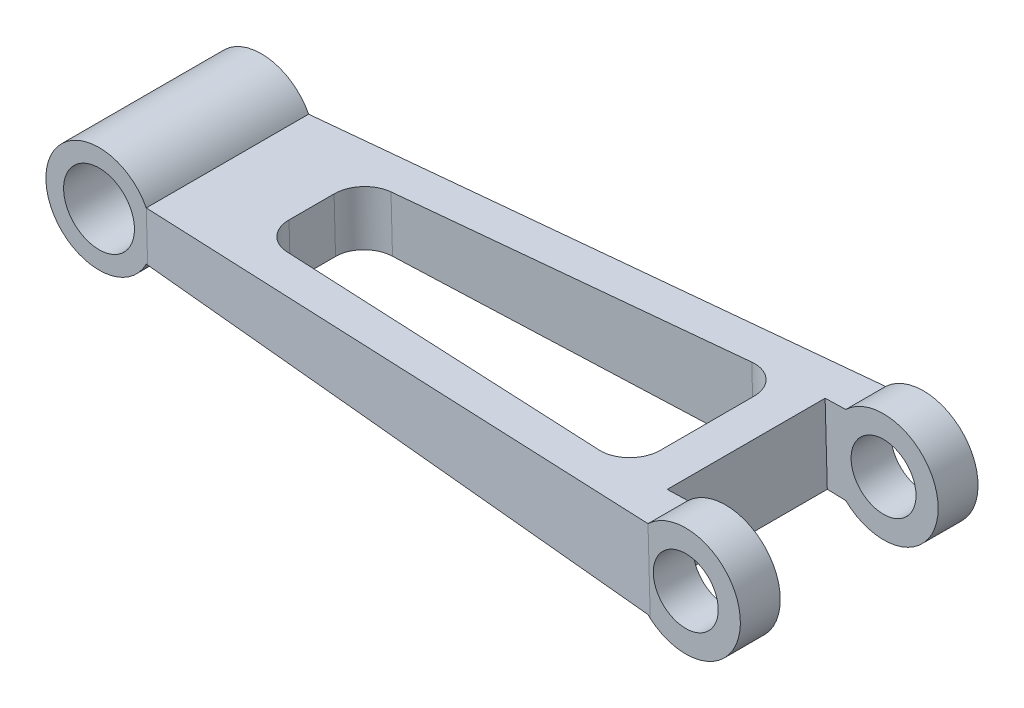
ISO-10303-21;
HEADER;
FILE_DESCRIPTION(('STEP AP214'),'2;1');
FILE_NAME('part.step','',(''),(''),'','','');
FILE_SCHEMA(('AUTOMOTIVE_DESIGN { 1 0 10303 214 1 1 1 1 }'));
ENDSEC;
DATA;
#1=APPLICATION_CONTEXT('core data for automotive mechanical design processes');
#2=APPLICATION_PROTOCOL_DEFINITION('international standard','automotive_design',2000,#1);
#3=PRODUCT_CONTEXT('',#1,'mechanical');
#4=PRODUCT('Part','Part','',(#3));
#5=PRODUCT_RELATED_PRODUCT_CATEGORY('part','',(#4));
#6=PRODUCT_DEFINITION_FORMATION('','',#4);
#7=PRODUCT_DEFINITION_CONTEXT('part definition',#1,'design');
#8=PRODUCT_DEFINITION('design','',#6,#7);
#9=PRODUCT_DEFINITION_SHAPE('','',#8);
#10=(LENGTH_UNIT() NAMED_UNIT(*) SI_UNIT(.MILLI.,.METRE.));
#11=(NAMED_UNIT(*) PLANE_ANGLE_UNIT() SI_UNIT($,.RADIAN.));
#12=(NAMED_UNIT(*) SI_UNIT($,.STERADIAN.) SOLID_ANGLE_UNIT());
#13=UNCERTAINTY_MEASURE_WITH_UNIT(LENGTH_MEASURE(1.E-05),#10,'distance_accuracy_value','');
#14=(GEOMETRIC_REPRESENTATION_CONTEXT(3) GLOBAL_UNCERTAINTY_ASSIGNED_CONTEXT((#13)) GLOBAL_UNIT_ASSIGNED_CONTEXT((#10,
#11,#12)) REPRESENTATION_CONTEXT('',''));
#15=CARTESIAN_POINT('',(0.,0.,0.));
#16=DIRECTION('',(0.,0.,1.));
#17=DIRECTION('',(1.,0.,0.));
#18=AXIS2_PLACEMENT_3D('',#15,#16,#17);
#19=CARTESIAN_POINT('',(211.5,0.,-161.));
#20=DIRECTION('',(0.,0.,1.));
#21=DIRECTION('',(1.,0.,0.));
#22=AXIS2_PLACEMENT_3D('',#19,#20,#21);
#23=CYLINDRICAL_SURFACE('',#22,37.);
#24=CARTESIAN_POINT('',(211.5,0.,-27.0052259251168));
#25=DIRECTION('',(0.,0.,-1.));
#26=DIRECTION('',(-1.,0.,0.));
#27=AXIS2_PLACEMENT_3D('',#24,#25,#26);
#28=CIRCLE('',#27,37.);
#29=CARTESIAN_POINT('',(185.913473281115,26.7269461492287,-27.0052259251168));
#30=VERTEX_POINT('',#29);
#31=CARTESIAN_POINT('',(185.913473281115,-26.7269461492287,-27.0052259251168));
#32=VERTEX_POINT('',#31);
#33=EDGE_CURVE('E195',#30,#32,#28,.T.);
#34=ORIENTED_EDGE('',*,*,#33,.F.);
#35=DIRECTION('',(0.,0.,1.));
#36=VECTOR('',#35,1.);
#37=CARTESIAN_POINT('',(185.913473281115,26.7269461492288,-161.));
#38=LINE('',#37,#36);
#39=CARTESIAN_POINT('',(185.913473281115,26.7269461492288,0.));
#40=VERTEX_POINT('',#39);
#41=EDGE_CURVE('E296',#30,#40,#38,.T.);
#42=ORIENTED_EDGE('',*,*,#41,.T.);
#43=CARTESIAN_POINT('',(211.5,0.,0.));
#44=DIRECTION('',(0.,0.,1.));
#45=DIRECTION('',(1.,0.,0.));
#46=AXIS2_PLACEMENT_3D('',#43,#44,#45);
#47=CIRCLE('',#46,37.);
#48=CARTESIAN_POINT('',(187.445936746118,-28.1140897234513,0.));
#49=VERTEX_POINT('',#48);
#50=EDGE_CURVE('E288',#40,#49,#47,.F.);
#51=ORIENTED_EDGE('',*,*,#50,.T.);
#52=CARTESIAN_POINT('',(211.5,0.,1.73200187098438));
#53=DIRECTION('',(-0.0695582140918193,-0.0019437164176492,0.997576000522689));
#54=DIRECTION('',(0.997186748652514,0.0278651239127497,0.0695853661422832));
#55=AXIS2_PLACEMENT_3D('',#52,#53,#54);
#56=ELLIPSE('',#55,37.0899059125455,37.);
#57=CARTESIAN_POINT('',(185.913473281115,-26.7269461492287,-0.104151671645378));
#58=VERTEX_POINT('',#57);
#59=EDGE_CURVE('E262',#58,#49,#56,.T.);
#60=ORIENTED_EDGE('',*,*,#59,.F.);
#61=DIRECTION('',(0.,0.,1.));
#62=VECTOR('',#61,1.);
#63=CARTESIAN_POINT('',(185.913473281115,-26.7269461492287,-161.));
#64=LINE('',#63,#62);
#65=EDGE_CURVE('E303',#32,#58,#64,.T.);
#66=ORIENTED_EDGE('',*,*,#65,.F.);
#67=EDGE_LOOP('',(#34,#42,#51,#60,#66));
#68=FACE_BOUND('',#67,.T.);
#69=ADVANCED_FACE('F41',(#68),#23,.T.);
#70=CARTESIAN_POINT('',(211.5,0.,-133.988681084418));
#71=DIRECTION('',(0.,0.,1.));
#72=DIRECTION('',(1.,0.,0.));
#73=AXIS2_PLACEMENT_3D('',#70,#71,#72);
#74=CIRCLE('',#73,37.);
#75=CARTESIAN_POINT('',(185.913473281115,-26.7269461492287,-133.988681084418));
#76=VERTEX_POINT('',#75);
#77=CARTESIAN_POINT('',(185.913473281115,26.7269461492287,-133.988681084418));
#78=VERTEX_POINT('',#77);
#79=EDGE_CURVE('E187',#76,#78,#74,.T.);
#80=ORIENTED_EDGE('',*,*,#79,.F.);
#81=CARTESIAN_POINT('',(185.913473281115,-26.7269461492287,-160.895848328355));
#82=VERTEX_POINT('',#81);
#83=EDGE_CURVE('E185',#82,#76,#64,.T.);
#84=ORIENTED_EDGE('',*,*,#83,.F.);
#85=CARTESIAN_POINT('',(211.5,0.,-162.732001870984));
#86=DIRECTION('',(-0.0695582140918193,-0.0019437164176492,-0.997576000522689));
#87=DIRECTION('',(-0.997186748652514,-0.0278651239127497,0.0695853661422832));
#88=AXIS2_PLACEMENT_3D('',#85,#86,#87);
#89=ELLIPSE('',#88,37.0899059125455,37.);
#90=CARTESIAN_POINT('',(187.445936746119,-28.1140897234512,-161.));
#91=VERTEX_POINT('',#90);
#92=EDGE_CURVE('E268',#91,#82,#89,.T.);
#93=ORIENTED_EDGE('',*,*,#92,.F.);
#94=CARTESIAN_POINT('',(211.5,0.,-161.));
#95=DIRECTION('',(0.,0.,1.));
#96=DIRECTION('',(1.,0.,0.));
#97=AXIS2_PLACEMENT_3D('',#94,#95,#96);
#98=CIRCLE('',#97,37.);
#99=CARTESIAN_POINT('',(185.913473281115,26.7269461492288,-161.));
#100=VERTEX_POINT('',#99);
#101=EDGE_CURVE('E289',#100,#91,#98,.F.);
#102=ORIENTED_EDGE('',*,*,#101,.F.);
#103=EDGE_CURVE('E310',#100,#78,#38,.T.);
#104=ORIENTED_EDGE('',*,*,#103,.T.);
#105=EDGE_LOOP('',(#80,#84,#93,#102,#104));
#106=FACE_BOUND('',#105,.T.);
#107=ADVANCED_FACE('F333',(#106),#23,.T.);
#108=CARTESIAN_POINT('',(-0.601210303276677,-21.5150289465088,-161.));
#109=DIRECTION('',(-0.0279328330855487,-0.999609802290781,0.));
#110=DIRECTION('',(0.999609802290781,-0.0279328330855487,0.));
#111=AXIS2_PLACEMENT_3D('',#108,#109,#110);
#112=PLANE('',#111);
#113=CARTESIAN_POINT('',(127.338014981682,-25.0901289673263,-48.318049769932));
#114=DIRECTION('',(-0.0279328330855487,-0.999609802290781,0.));
#115=DIRECTION('',(-0.999609802290781,0.0279328330855487,0.));
#116=AXIS2_PLACEMENT_3D('',#113,#114,#115);
#117=ELLIPSE('',#116,20.0312585050372,20.);
#118=CARTESIAN_POINT('',(147.361457335538,-25.6496587676411,-48.318049769932));
#119=VERTEX_POINT('',#118);
#120=CARTESIAN_POINT('',(125.859784950591,-25.0488216966034,-28.3726254946317));
#121=VERTEX_POINT('',#120);
#122=EDGE_CURVE('E249',#119,#121,#117,.T.);
#123=ORIENTED_EDGE('',*,*,#122,.F.);
#124=DIRECTION('',(0.,0.,1.));
#125=VECTOR('',#124,1.);
#126=CARTESIAN_POINT('',(147.361457335538,-25.649658767641,-161.));
#127=LINE('',#126,#125);
#128=CARTESIAN_POINT('',(147.361457335538,-25.649658767641,-111.705387917541));
#129=VERTEX_POINT('',#128);
#130=EDGE_CURVE('E222',#129,#119,#127,.T.);
#131=ORIENTED_EDGE('',*,*,#130,.F.);
#132=CARTESIAN_POINT('',(127.338014981682,-25.0901289673263,-111.705387917541));
#133=DIRECTION('',(-0.0279328330855487,-0.999609802290781,0.));
#134=DIRECTION('',(-0.999609802290781,0.0279328330855487,0.));
#135=AXIS2_PLACEMENT_3D('',#132,#133,#134);
#136=ELLIPSE('',#135,20.0312585050372,20.);
#137=CARTESIAN_POINT('',(125.94467641406,-25.0511938813039,-131.656907927995));
#138=VERTEX_POINT('',#137);
#139=EDGE_CURVE('E237',#138,#129,#136,.T.);
#140=ORIENTED_EDGE('',*,*,#139,.F.);
#141=DIRECTION('',(0.997194277668707,-0.0278653343015954,-0.069477303697299));
#142=VECTOR('',#141,1.);
#143=CARTESIAN_POINT('',(2.0425977583593,-21.5889068227828,-123.024304893395));
#144=LINE('',#143,#142);
#145=CARTESIAN_POINT('',(-102.891302443931,-18.6566615480276,-115.713267700581));
#146=VERTEX_POINT('',#145);
#147=EDGE_CURVE('E239',#146,#138,#144,.T.);
#148=ORIENTED_EDGE('',*,*,#147,.F.);
#149=CARTESIAN_POINT('',(-101.497963876309,-18.6955966340499,-95.7617476901274));
#150=DIRECTION('',(-0.0279328330855487,-0.999609802290781,0.));
#151=DIRECTION('',(-0.999609802290781,0.0279328330855487,0.));
#152=AXIS2_PLACEMENT_3D('',#149,#150,#151);
#153=ELLIPSE('',#152,20.0312585050372,20.);
#154=CARTESIAN_POINT('',(-121.521406230164,-18.1360668337353,-95.7617476901273));
#155=VERTEX_POINT('',#154);
#156=EDGE_CURVE('E241',#155,#146,#153,.T.);
#157=ORIENTED_EDGE('',*,*,#156,.F.);
#158=DIRECTION('',(0.,0.,-1.));
#159=VECTOR('',#158,1.);
#160=CARTESIAN_POINT('',(-121.521406230164,-18.1360668337353,-161.));
#161=LINE('',#160,#159);
#162=CARTESIAN_POINT('',(-121.521406230164,-18.1360668337353,-65.2382523098727));
#163=VERTEX_POINT('',#162);
#164=EDGE_CURVE('E243',#163,#155,#161,.T.);
#165=ORIENTED_EDGE('',*,*,#164,.F.);
#166=CARTESIAN_POINT('',(-101.497963876309,-18.6955966340499,-65.2382523098726));
#167=DIRECTION('',(-0.0279328330855487,-0.999609802290781,0.));
#168=DIRECTION('',(-0.999609802290781,0.0279328330855487,0.));
#169=AXIS2_PLACEMENT_3D('',#166,#167,#168);
#170=ELLIPSE('',#169,20.0312585050372,20.);
#171=CARTESIAN_POINT('',(-102.9761939074,-18.654289363327,-45.2928280345723));
#172=VERTEX_POINT('',#171);
#173=EDGE_CURVE('E245',#172,#163,#170,.T.);
#174=ORIENTED_EDGE('',*,*,#173,.F.);
#175=DIRECTION('',(-0.996890552644757,0.0278568470895068,-0.0737103935538481));
#176=VECTOR('',#175,1.);
#177=CARTESIAN_POINT('',(-9.65973759061544,-21.2618998453953,-38.392980602061));
#178=LINE('',#177,#176);
#179=EDGE_CURVE('E247',#121,#172,#178,.T.);
#180=ORIENTED_EDGE('',*,*,#179,.F.);
#181=EDGE_LOOP('',(#123,#131,#140,#148,#157,#165,#174,#180));
#182=FACE_BOUND('',#181,.T.);
#183=DIRECTION('',(0.,0.,1.));
#184=VECTOR('',#183,1.);
#185=CARTESIAN_POINT('',(173.39193239555,-26.3770475080501,-161.));
#186=LINE('',#185,#184);
#187=CARTESIAN_POINT('',(173.39193239555,-26.37704750805,-133.988681084418));
#188=VERTEX_POINT('',#187);
#189=CARTESIAN_POINT('',(173.39193239555,-26.37704750805,-27.0052259251168));
#190=VERTEX_POINT('',#189);
#191=EDGE_CURVE('E163',#188,#190,#186,.T.);
#192=ORIENTED_EDGE('',*,*,#191,.T.);
#193=DIRECTION('',(0.999609802290781,-0.0279328330855487,0.));
#194=VECTOR('',#193,1.);
#195=CARTESIAN_POINT('',(-0.601210303276677,-21.5150289465088,-27.0052259251168));
#196=LINE('',#195,#194);
#197=EDGE_CURVE('E171',#190,#32,#196,.T.);
#198=ORIENTED_EDGE('',*,*,#197,.T.);
#199=ORIENTED_EDGE('',*,*,#65,.T.);
#200=DIRECTION('',(-0.997194277668706,0.0278653343015954,-0.0694773036972989));
#201=VECTOR('',#200,1.);
#202=CARTESIAN_POINT('',(-10.8481317137672,-21.2286916729606,-13.8130809067358));
#203=LINE('',#202,#201);
#204=CARTESIAN_POINT('',(-178.588216938653,-16.5414069028384,-25.5));
#205=VERTEX_POINT('',#204);
#206=EDGE_CURVE('E259',#58,#205,#203,.T.);
#207=ORIENTED_EDGE('',*,*,#206,.T.);
#208=DIRECTION('',(-0.999609802290781,0.0279328330855487,0.));
#209=VECTOR('',#208,1.);
#210=CARTESIAN_POINT('',(-0.601210303276677,-21.5150289465088,-25.5));
#211=LINE('',#210,#209);
#212=CARTESIAN_POINT('',(-179.511953074266,-16.5155942635145,-25.5));
#213=VERTEX_POINT('',#212);
#214=EDGE_CURVE('E276',#205,#213,#211,.T.);
#215=ORIENTED_EDGE('',*,*,#214,.T.);
#216=DIRECTION('',(0.,0.,1.));
#217=VECTOR('',#216,1.);
#218=CARTESIAN_POINT('',(-179.511953074266,-16.5155942635145,-161.));
#219=LINE('',#218,#217);
#220=CARTESIAN_POINT('',(-179.511953074266,-16.5155942635145,-135.5));
#221=VERTEX_POINT('',#220);
#222=EDGE_CURVE('E304',#221,#213,#219,.T.);
#223=ORIENTED_EDGE('',*,*,#222,.F.);
#224=DIRECTION('',(0.999609802290781,-0.0279328330855487,0.));
#225=VECTOR('',#224,1.);
#226=CARTESIAN_POINT('',(-0.601210303276677,-21.5150289465088,-135.5));
#227=LINE('',#226,#225);
#228=CARTESIAN_POINT('',(-178.588216938653,-16.5414069028384,-135.5));
#229=VERTEX_POINT('',#228);
#230=EDGE_CURVE('E285',#221,#229,#227,.T.);
#231=ORIENTED_EDGE('',*,*,#230,.T.);
#232=DIRECTION('',(0.997194277668706,-0.0278653343015954,-0.0694773036972989));
#233=VECTOR('',#232,1.);
#234=CARTESIAN_POINT('',(0.306329803875222,-21.5403890082783,-147.964081505641));
#235=LINE('',#234,#233);
#236=EDGE_CURVE('E266',#229,#82,#235,.T.);
#237=ORIENTED_EDGE('',*,*,#236,.T.);
#238=ORIENTED_EDGE('',*,*,#83,.T.);
#239=DIRECTION('',(-0.999609802290781,0.0279328330855487,0.));
#240=VECTOR('',#239,1.);
#241=CARTESIAN_POINT('',(-0.601210303276677,-21.5150289465088,-133.988681084418));
#242=LINE('',#241,#240);
#243=EDGE_CURVE('E175',#76,#188,#242,.T.);
#244=ORIENTED_EDGE('',*,*,#243,.T.);
#245=EDGE_LOOP('',(#192,#198,#199,#207,#215,#223,#231,#237,#238,#244));
#246=FACE_BOUND('',#245,.T.);
#247=ADVANCED_FACE('F182',(#182,#246),#112,.T.);
#248=CARTESIAN_POINT('',(-0.60121030327668,21.5150289465088,-161.));
#249=DIRECTION('',(0.0279328330855488,-0.999609802290781,0.));
#250=DIRECTION('',(0.999609802290781,0.0279328330855488,0.));
#251=AXIS2_PLACEMENT_3D('',#248,#249,#250);
#252=PLANE('',#251);
#253=DIRECTION('',(0.,0.,-1.));
#254=VECTOR('',#253,1.);
#255=CARTESIAN_POINT('',(145.929081189484,25.6096328258068,-111.705387917541));
#256=LINE('',#255,#254);
#257=CARTESIAN_POINT('',(145.929081189484,25.6096328258068,-48.318049769932));
#258=VERTEX_POINT('',#257);
#259=CARTESIAN_POINT('',(145.929081189484,25.6096328258068,-111.705387917541));
#260=VERTEX_POINT('',#259);
#261=EDGE_CURVE('E199',#258,#260,#256,.T.);
#262=ORIENTED_EDGE('',*,*,#261,.F.);
#263=CARTESIAN_POINT('',(125.936885143668,25.0509761640958,-48.318049769932));
#264=DIRECTION('',(-0.0279328330855488,0.999609802290781,0.));
#265=DIRECTION('',(-0.999609802290781,-0.0279328330855488,0.));
#266=AXIS2_PLACEMENT_3D('',#263,#264,#265);
#267=CIRCLE('',#266,20.);
#268=CARTESIAN_POINT('',(124.460961870331,25.0097333528041,-28.3726254946317));
#269=VERTEX_POINT('',#268);
#270=EDGE_CURVE('E170',#269,#258,#267,.T.);
#271=ORIENTED_EDGE('',*,*,#270,.F.);
#272=DIRECTION('',(0.996882080821933,0.0278566103551208,0.0738249700010463));
#273=VECTOR('',#272,1.);
#274=CARTESIAN_POINT('',(-104.017921571213,18.6251795998101,-45.2928280345723));
#275=LINE('',#274,#273);
#276=CARTESIAN_POINT('',(-104.017921571213,18.6251795998101,-45.2928280345723));
#277=VERTEX_POINT('',#276);
#278=EDGE_CURVE('E216',#277,#269,#275,.T.);
#279=ORIENTED_EDGE('',*,*,#278,.F.);
#280=CARTESIAN_POINT('',(-102.541998297876,18.6664224111018,-65.2382523098726));
#281=DIRECTION('',(-0.0279328330855488,0.999609802290781,0.));
#282=DIRECTION('',(-0.999609802290781,-0.0279328330855488,0.));
#283=AXIS2_PLACEMENT_3D('',#280,#281,#282);
#284=CIRCLE('',#283,20.);
#285=CARTESIAN_POINT('',(-122.534194343691,18.1077657493908,-65.2382523098727));
#286=VERTEX_POINT('',#285);
#287=EDGE_CURVE('E213',#286,#277,#284,.T.);
#288=ORIENTED_EDGE('',*,*,#287,.F.);
#289=DIRECTION('',(0.,0.,1.));
#290=VECTOR('',#289,1.);
#291=CARTESIAN_POINT('',(-122.534194343691,18.1077657493908,-65.2382523098727));
#292=LINE('',#291,#290);
#293=CARTESIAN_POINT('',(-122.534194343691,18.1077657493908,-95.7617476901273));
#294=VERTEX_POINT('',#293);
#295=EDGE_CURVE('E210',#294,#286,#292,.T.);
#296=ORIENTED_EDGE('',*,*,#295,.F.);
#297=CARTESIAN_POINT('',(-102.541998297876,18.6664224111018,-95.7617476901274));
#298=DIRECTION('',(-0.0279328330855488,0.999609802290781,0.));
#299=DIRECTION('',(-0.999609802290781,-0.0279328330855488,0.));
#300=AXIS2_PLACEMENT_3D('',#297,#298,#299);
#301=CIRCLE('',#300,20.);
#302=CARTESIAN_POINT('',(-103.933162579712,18.6275480827488,-115.713267700581));
#303=VERTEX_POINT('',#302);
#304=EDGE_CURVE('E207',#303,#294,#301,.T.);
#305=ORIENTED_EDGE('',*,*,#304,.F.);
#306=DIRECTION('',(-0.997186748652514,-0.0278651239127497,0.0695853661422832));
#307=VECTOR('',#306,1.);
#308=CARTESIAN_POINT('',(-103.933162579712,18.6275480827488,-115.713267700581));
#309=LINE('',#308,#307);
#310=CARTESIAN_POINT('',(124.545720861832,25.0121018357428,-131.656907927995));
#311=VERTEX_POINT('',#310);
#312=EDGE_CURVE('E204',#311,#303,#309,.T.);
#313=ORIENTED_EDGE('',*,*,#312,.F.);
#314=CARTESIAN_POINT('',(125.936885143668,25.0509761640958,-111.705387917541));
#315=DIRECTION('',(-0.0279328330855488,0.999609802290781,0.));
#316=DIRECTION('',(-0.999609802290781,-0.0279328330855488,0.));
#317=AXIS2_PLACEMENT_3D('',#314,#315,#316);
#318=CIRCLE('',#317,20.);
#319=EDGE_CURVE('E201',#260,#311,#318,.T.);
#320=ORIENTED_EDGE('',*,*,#319,.F.);
#321=EDGE_LOOP('',(#262,#271,#279,#288,#296,#305,#313,#320));
#322=FACE_BOUND('',#321,.T.);
#323=DIRECTION('',(0.999609802290781,0.0279328330855488,0.));
#324=VECTOR('',#323,1.);
#325=CARTESIAN_POINT('',(-0.60121030327668,21.5150289465088,-27.0052259251168));
#326=LINE('',#325,#324);
#327=CARTESIAN_POINT('',(171.918936049044,26.3358864860311,-27.0052259251168));
#328=VERTEX_POINT('',#327);
#329=EDGE_CURVE('E190',#328,#30,#326,.T.);
#330=ORIENTED_EDGE('',*,*,#329,.F.);
#331=DIRECTION('',(0.,0.,1.));
#332=VECTOR('',#331,1.);
#333=CARTESIAN_POINT('',(171.918936049044,26.3358864860311,-161.));
#334=LINE('',#333,#332);
#335=CARTESIAN_POINT('',(171.918936049044,26.3358864860311,-133.988681084418));
#336=VERTEX_POINT('',#335);
#337=EDGE_CURVE('E11',#336,#328,#334,.T.);
#338=ORIENTED_EDGE('',*,*,#337,.F.);
#339=DIRECTION('',(-0.999609802290781,-0.0279328330855488,0.));
#340=VECTOR('',#339,1.);
#341=CARTESIAN_POINT('',(-0.60121030327668,21.5150289465088,-133.988681084418));
#342=LINE('',#341,#340);
#343=EDGE_CURVE('E178',#78,#336,#342,.T.);
#344=ORIENTED_EDGE('',*,*,#343,.F.);
#345=ORIENTED_EDGE('',*,*,#103,.F.);
#346=DIRECTION('',(0.997186748652514,0.0278651239127497,-0.0695853661422832));
#347=VECTOR('',#346,1.);
#348=CARTESIAN_POINT('',(0.301916769733205,21.5402656916144,-148.047713843433));
#349=LINE('',#348,#347);
#350=CARTESIAN_POINT('',(-179.511953074266,16.5155942635146,-135.5));
#351=VERTEX_POINT('',#350);
#352=EDGE_CURVE('E264',#351,#100,#349,.T.);
#353=ORIENTED_EDGE('',*,*,#352,.F.);
#354=DIRECTION('',(0.,0.,1.));
#355=VECTOR('',#354,1.);
#356=CARTESIAN_POINT('',(-179.511953074266,16.5155942635145,-161.));
#357=LINE('',#356,#355);
#358=CARTESIAN_POINT('',(-179.511953074266,16.5155942635146,-25.5));
#359=VERTEX_POINT('',#358);
#360=EDGE_CURVE('E307',#351,#359,#357,.T.);
#361=ORIENTED_EDGE('',*,*,#360,.T.);
#362=DIRECTION('',(-0.997186748652514,-0.0278651239127497,-0.0695853661422832));
#363=VECTOR('',#362,1.);
#364=CARTESIAN_POINT('',(-10.8698096380389,21.2280859107533,-13.7318679887326));
#365=LINE('',#364,#363);
#366=EDGE_CURVE('E255',#40,#359,#365,.T.);
#367=ORIENTED_EDGE('',*,*,#366,.F.);
#368=ORIENTED_EDGE('',*,*,#41,.F.);
#369=EDGE_LOOP('',(#330,#338,#344,#345,#353,#361,#367,#368));
#370=FACE_BOUND('',#369,.T.);
#371=ADVANCED_FACE('F348',(#322,#370),#252,.F.);
#372=CARTESIAN_POINT('',(211.5,0.,-161.));
#373=DIRECTION('',(0.,0.,1.));
#374=DIRECTION('',(1.,0.,0.));
#375=AXIS2_PLACEMENT_3D('',#372,#373,#374);
#376=CYLINDRICAL_SURFACE('',#375,22.);
#377=CARTESIAN_POINT('',(211.5,0.,0.));
#378=DIRECTION('',(0.,0.,1.));
#379=DIRECTION('',(1.,0.,0.));
#380=AXIS2_PLACEMENT_3D('',#377,#378,#379);
#381=CIRCLE('',#380,22.);
#382=CARTESIAN_POINT('',(233.5,0.,0.));
#383=VERTEX_POINT('',#382);
#384=EDGE_CURVE('E293',#383,#383,#381,.F.);
#385=ORIENTED_EDGE('',*,*,#384,.F.);
#386=EDGE_LOOP('',(#385));
#387=FACE_BOUND('',#386,.T.);
#388=CARTESIAN_POINT('',(211.5,0.,-27.0052259251168));
#389=DIRECTION('',(0.,0.,-1.));
#390=DIRECTION('',(-1.,0.,0.));
#391=AXIS2_PLACEMENT_3D('',#388,#389,#390);
#392=CIRCLE('',#391,22.);
#393=CARTESIAN_POINT('',(189.5,0.,-27.0052259251168));
#394=VERTEX_POINT('',#393);
#395=EDGE_CURVE('E186',#394,#394,#392,.T.);
#396=ORIENTED_EDGE('',*,*,#395,.T.);
#397=EDGE_LOOP('',(#396));
#398=FACE_BOUND('',#397,.T.);
#399=ADVANCED_FACE('F389',(#387,#398),#376,.F.);
#400=CARTESIAN_POINT('',(211.5,0.,-161.));
#401=DIRECTION('',(0.,0.,1.));
#402=DIRECTION('',(1.,0.,0.));
#403=AXIS2_PLACEMENT_3D('',#400,#401,#402);
#404=CIRCLE('',#403,22.);
#405=CARTESIAN_POINT('',(233.5,0.,-161.));
#406=VERTEX_POINT('',#405);
#407=EDGE_CURVE('E292',#406,#406,#404,.F.);
#408=ORIENTED_EDGE('',*,*,#407,.T.);
#409=EDGE_LOOP('',(#408));
#410=FACE_BOUND('',#409,.T.);
#411=CARTESIAN_POINT('',(211.5,0.,-133.988681084418));
#412=DIRECTION('',(0.,0.,1.));
#413=DIRECTION('',(1.,0.,0.));
#414=AXIS2_PLACEMENT_3D('',#411,#412,#413);
#415=CIRCLE('',#414,22.);
#416=CARTESIAN_POINT('',(233.5,0.,-133.988681084418));
#417=VERTEX_POINT('',#416);
#418=EDGE_CURVE('E316',#417,#417,#415,.T.);
#419=ORIENTED_EDGE('',*,*,#418,.T.);
#420=EDGE_LOOP('',(#419));
#421=FACE_BOUND('',#420,.T.);
#422=ADVANCED_FACE('F321',(#410,#421),#376,.F.);
#423=CARTESIAN_POINT('',(-211.5,0.,-161.));
#424=DIRECTION('',(0.,0.,1.));
#425=DIRECTION('',(1.,0.,0.));
#426=AXIS2_PLACEMENT_3D('',#423,#424,#425);
#427=CYLINDRICAL_SURFACE('',#426,36.);
#428=ORIENTED_EDGE('',*,*,#360,.F.);
#429=CARTESIAN_POINT('',(-211.5,0.,-135.5));
#430=DIRECTION('',(0.,0.,-1.));
#431=DIRECTION('',(-1.,0.,0.));
#432=AXIS2_PLACEMENT_3D('',#429,#430,#431);
#433=CIRCLE('',#432,36.);
#434=EDGE_CURVE('E282',#351,#221,#433,.F.);
#435=ORIENTED_EDGE('',*,*,#434,.T.);
#436=ORIENTED_EDGE('',*,*,#222,.T.);
#437=CARTESIAN_POINT('',(-211.5,0.,-25.5));
#438=DIRECTION('',(0.,0.,1.));
#439=DIRECTION('',(1.,0.,0.));
#440=AXIS2_PLACEMENT_3D('',#437,#438,#439);
#441=CIRCLE('',#440,36.);
#442=EDGE_CURVE('E273',#213,#359,#441,.F.);
#443=ORIENTED_EDGE('',*,*,#442,.T.);
#444=EDGE_LOOP('',(#428,#435,#436,#443));
#445=FACE_BOUND('',#444,.T.);
#446=ADVANCED_FACE('F361',(#445),#427,.T.);
#447=CARTESIAN_POINT('',(0.,0.,-161.));
#448=DIRECTION('',(0.,0.,1.));
#449=DIRECTION('',(1.,0.,0.));
#450=AXIS2_PLACEMENT_3D('',#447,#448,#449);
#451=PLANE('',#450);
#452=ORIENTED_EDGE('',*,*,#407,.F.);
#453=EDGE_LOOP('',(#452));
#454=FACE_BOUND('',#453,.T.);
#455=DIRECTION('',(0.0279328330855488,-0.999609802290781,0.));
#456=VECTOR('',#455,1.);
#457=CARTESIAN_POINT('',(186.514683584392,5.21191720271991,-161.));
#458=LINE('',#457,#456);
#459=EDGE_CURVE('E48',#100,#91,#458,.T.);
#460=ORIENTED_EDGE('',*,*,#459,.F.);
#461=ORIENTED_EDGE('',*,*,#101,.T.);
#462=EDGE_LOOP('',(#460,#461));
#463=FACE_BOUND('',#462,.T.);
#464=ADVANCED_FACE('F373',(#454,#463),#451,.F.);
#465=CARTESIAN_POINT('',(0.,0.,0.));
#466=DIRECTION('',(0.,0.,1.));
#467=DIRECTION('',(1.,0.,0.));
#468=AXIS2_PLACEMENT_3D('',#465,#466,#467);
#469=PLANE('',#468);
#470=ORIENTED_EDGE('',*,*,#384,.T.);
#471=EDGE_LOOP('',(#470));
#472=FACE_BOUND('',#471,.T.);
#473=ORIENTED_EDGE('',*,*,#50,.F.);
#474=DIRECTION('',(0.0279328330855488,-0.999609802290781,0.));
#475=VECTOR('',#474,1.);
#476=CARTESIAN_POINT('',(186.514683584391,5.2119172027199,0.));
#477=LINE('',#476,#475);
#478=EDGE_CURVE('E302',#40,#49,#477,.T.);
#479=ORIENTED_EDGE('',*,*,#478,.T.);
#480=EDGE_LOOP('',(#473,#479));
#481=FACE_BOUND('',#480,.T.);
#482=ADVANCED_FACE('F355',(#472,#481),#469,.T.);
#483=CARTESIAN_POINT('',(-184.009139201039,177.45277243233,-25.5));
#484=DIRECTION('',(0.,0.,1.));
#485=DIRECTION('',(1.,0.,0.));
#486=AXIS2_PLACEMENT_3D('',#483,#484,#485);
#487=PLANE('',#486);
#488=DIRECTION('',(0.0279328330855488,-0.999609802290781,0.));
#489=VECTOR('',#488,1.);
#490=CARTESIAN_POINT('',(-184.009139201039,177.45277243233,-25.5));
#491=LINE('',#490,#489);
#492=EDGE_CURVE('E251',#359,#205,#491,.T.);
#493=ORIENTED_EDGE('',*,*,#492,.F.);
#494=ORIENTED_EDGE('',*,*,#442,.F.);
#495=ORIENTED_EDGE('',*,*,#214,.F.);
#496=EDGE_LOOP('',(#493,#494,#495));
#497=FACE_BOUND('',#496,.T.);
#498=CARTESIAN_POINT('',(-211.5,0.,-25.5));
#499=DIRECTION('',(0.,0.,1.));
#500=DIRECTION('',(1.,0.,0.));
#501=AXIS2_PLACEMENT_3D('',#498,#499,#500);
#502=CIRCLE('',#501,24.);
#503=CARTESIAN_POINT('',(-187.5,0.,-25.5));
#504=VERTEX_POINT('',#503);
#505=EDGE_CURVE('E270',#504,#504,#502,.F.);
#506=ORIENTED_EDGE('',*,*,#505,.T.);
#507=EDGE_LOOP('',(#506));
#508=FACE_BOUND('',#507,.T.);
#509=ADVANCED_FACE('F381',(#497,#508),#487,.T.);
#510=CARTESIAN_POINT('',(181.416287154341,187.664124318045,0.));
#511=DIRECTION('',(-0.0695582140918193,-0.0019437164176492,0.997576000522689));
#512=DIRECTION('',(0.997577884965809,0.,0.0695583454888236));
#513=AXIS2_PLACEMENT_3D('',#510,#511,#512);
#514=PLANE('',#513);
#515=ORIENTED_EDGE('',*,*,#59,.T.);
#516=ORIENTED_EDGE('',*,*,#478,.F.);
#517=ORIENTED_EDGE('',*,*,#366,.T.);
#518=ORIENTED_EDGE('',*,*,#492,.T.);
#519=ORIENTED_EDGE('',*,*,#206,.F.);
#520=EDGE_LOOP('',(#515,#516,#517,#518,#519));
#521=FACE_BOUND('',#520,.T.);
#522=ADVANCED_FACE('F357',(#521),#514,.T.);
#523=CARTESIAN_POINT('',(-184.009139201039,177.45277243233,-135.5));
#524=DIRECTION('',(0.,0.,-1.));
#525=DIRECTION('',(-1.,0.,0.));
#526=AXIS2_PLACEMENT_3D('',#523,#524,#525);
#527=PLANE('',#526);
#528=ORIENTED_EDGE('',*,*,#434,.F.);
#529=DIRECTION('',(0.0279328330855488,-0.999609802290781,0.));
#530=VECTOR('',#529,1.);
#531=CARTESIAN_POINT('',(-184.009139201039,177.45277243233,-135.5));
#532=LINE('',#531,#530);
#533=EDGE_CURVE('E252',#351,#229,#532,.T.);
#534=ORIENTED_EDGE('',*,*,#533,.T.);
#535=ORIENTED_EDGE('',*,*,#230,.F.);
#536=EDGE_LOOP('',(#528,#534,#535));
#537=FACE_BOUND('',#536,.T.);
#538=CARTESIAN_POINT('',(-211.5,0.,-135.5));
#539=DIRECTION('',(0.,0.,-1.));
#540=DIRECTION('',(-1.,0.,0.));
#541=AXIS2_PLACEMENT_3D('',#538,#539,#540);
#542=CIRCLE('',#541,24.);
#543=CARTESIAN_POINT('',(-187.5,0.,-135.5));
#544=VERTEX_POINT('',#543);
#545=EDGE_CURVE('E279',#544,#544,#542,.F.);
#546=ORIENTED_EDGE('',*,*,#545,.T.);
#547=EDGE_LOOP('',(#546));
#548=FACE_BOUND('',#547,.T.);
#549=ADVANCED_FACE('F364',(#537,#548),#527,.T.);
#550=CARTESIAN_POINT('',(181.416287154341,187.664124318045,-161.));
#551=DIRECTION('',(-0.0695582140918193,-0.0019437164176492,-0.997576000522689));
#552=DIRECTION('',(-0.997577884965809,0.,0.0695583454888236));
#553=AXIS2_PLACEMENT_3D('',#550,#551,#552);
#554=PLANE('',#553);
#555=ORIENTED_EDGE('',*,*,#92,.T.);
#556=ORIENTED_EDGE('',*,*,#236,.F.);
#557=ORIENTED_EDGE('',*,*,#533,.F.);
#558=ORIENTED_EDGE('',*,*,#352,.T.);
#559=ORIENTED_EDGE('',*,*,#459,.T.);
#560=EDGE_LOOP('',(#555,#556,#557,#558,#559));
#561=FACE_BOUND('',#560,.T.);
#562=ADVANCED_FACE('F367',(#561),#554,.T.);
#563=CARTESIAN_POINT('',(-211.5,0.,-161.));
#564=DIRECTION('',(0.,0.,1.));
#565=DIRECTION('',(1.,0.,0.));
#566=AXIS2_PLACEMENT_3D('',#563,#564,#565);
#567=CYLINDRICAL_SURFACE('',#566,24.);
#568=CARTESIAN_POINT('',(-187.5,0.,-25.5));
#569=CARTESIAN_POINT('',(-187.5,0.,-26.6458333333333));
#570=CARTESIAN_POINT('',(-187.5,0.,-27.7916666666667));
#571=CARTESIAN_POINT('',(-187.5,0.,-30.0833333333333));
#572=CARTESIAN_POINT('',(-187.5,0.,-31.2291666666667));
#573=CARTESIAN_POINT('',(-187.5,0.,-33.5208333333333));
#574=CARTESIAN_POINT('',(-187.5,0.,-34.6666666666667));
#575=CARTESIAN_POINT('',(-187.5,0.,-36.9583333333333));
#576=CARTESIAN_POINT('',(-187.5,0.,-38.1041666666667));
#577=CARTESIAN_POINT('',(-187.5,0.,-40.3958333333333));
#578=CARTESIAN_POINT('',(-187.5,0.,-41.5416666666667));
#579=CARTESIAN_POINT('',(-187.5,0.,-43.8333333333333));
#580=CARTESIAN_POINT('',(-187.5,0.,-44.9791666666667));
#581=CARTESIAN_POINT('',(-187.5,0.,-47.2708333333333));
#582=CARTESIAN_POINT('',(-187.5,0.,-48.4166666666667));
#583=CARTESIAN_POINT('',(-187.5,0.,-50.7083333333333));
#584=CARTESIAN_POINT('',(-187.5,0.,-51.8541666666667));
#585=CARTESIAN_POINT('',(-187.5,0.,-54.1458333333333));
#586=CARTESIAN_POINT('',(-187.5,0.,-55.2916666666667));
#587=CARTESIAN_POINT('',(-187.5,0.,-57.5833333333333));
#588=CARTESIAN_POINT('',(-187.5,0.,-58.7291666666667));
#589=CARTESIAN_POINT('',(-187.5,0.,-61.0208333333333));
#590=CARTESIAN_POINT('',(-187.5,0.,-62.1666666666667));
#591=CARTESIAN_POINT('',(-187.5,0.,-64.4583333333333));
#592=CARTESIAN_POINT('',(-187.5,0.,-65.6041666666667));
#593=CARTESIAN_POINT('',(-187.5,0.,-67.8958333333333));
#594=CARTESIAN_POINT('',(-187.5,0.,-69.0416666666667));
#595=CARTESIAN_POINT('',(-187.5,0.,-71.3333333333333));
#596=CARTESIAN_POINT('',(-187.5,0.,-72.4791666666667));
#597=CARTESIAN_POINT('',(-187.5,0.,-74.7708333333333));
#598=CARTESIAN_POINT('',(-187.5,0.,-75.9166666666667));
#599=CARTESIAN_POINT('',(-187.5,0.,-78.2083333333333));
#600=CARTESIAN_POINT('',(-187.5,0.,-79.3541666666667));
#601=CARTESIAN_POINT('',(-187.5,0.,-81.6458333333333));
#602=CARTESIAN_POINT('',(-187.5,0.,-82.7916666666667));
#603=CARTESIAN_POINT('',(-187.5,0.,-85.0833333333333));
#604=CARTESIAN_POINT('',(-187.5,0.,-86.2291666666667));
#605=CARTESIAN_POINT('',(-187.5,0.,-88.5208333333333));
#606=CARTESIAN_POINT('',(-187.5,0.,-89.6666666666667));
#607=CARTESIAN_POINT('',(-187.5,0.,-91.9583333333333));
#608=CARTESIAN_POINT('',(-187.5,0.,-93.1041666666667));
#609=CARTESIAN_POINT('',(-187.5,0.,-95.3958333333333));
#610=CARTESIAN_POINT('',(-187.5,0.,-96.5416666666667));
#611=CARTESIAN_POINT('',(-187.5,0.,-98.8333333333333));
#612=CARTESIAN_POINT('',(-187.5,0.,-99.9791666666667));
#613=CARTESIAN_POINT('',(-187.5,0.,-102.270833333333));
#614=CARTESIAN_POINT('',(-187.5,0.,-103.416666666667));
#615=CARTESIAN_POINT('',(-187.5,0.,-105.708333333333));
#616=CARTESIAN_POINT('',(-187.5,0.,-106.854166666667));
#617=CARTESIAN_POINT('',(-187.5,0.,-109.145833333333));
#618=CARTESIAN_POINT('',(-187.5,0.,-110.291666666667));
#619=CARTESIAN_POINT('',(-187.5,0.,-112.583333333333));
#620=CARTESIAN_POINT('',(-187.5,0.,-113.729166666667));
#621=CARTESIAN_POINT('',(-187.5,0.,-116.020833333333));
#622=CARTESIAN_POINT('',(-187.5,0.,-117.166666666667));
#623=CARTESIAN_POINT('',(-187.5,0.,-119.458333333333));
#624=CARTESIAN_POINT('',(-187.5,0.,-120.604166666667));
#625=CARTESIAN_POINT('',(-187.5,0.,-122.895833333333));
#626=CARTESIAN_POINT('',(-187.5,0.,-124.041666666667));
#627=CARTESIAN_POINT('',(-187.5,0.,-126.333333333333));
#628=CARTESIAN_POINT('',(-187.5,0.,-127.479166666667));
#629=CARTESIAN_POINT('',(-187.5,0.,-129.770833333333));
#630=CARTESIAN_POINT('',(-187.5,0.,-130.916666666667));
#631=CARTESIAN_POINT('',(-187.5,0.,-133.208333333333));
#632=CARTESIAN_POINT('',(-187.5,0.,-134.354166666667));
#633=CARTESIAN_POINT('',(-187.5,0.,-135.5));
#634=B_SPLINE_CURVE_WITH_KNOTS('',3,(#568,#569,#570,#571,#572,#573,#574,#575,#576,#577,#578,
#579,#580,#581,#582,#583,#584,#585,#586,#587,#588,#589,#590,#591,#592,#593,#594,#595,#596,#597,
#598,#599,#600,#601,#602,#603,#604,#605,#606,#607,#608,#609,#610,#611,#612,#613,#614,#615,#616,
#617,#618,#619,#620,#621,#622,#623,#624,#625,#626,#627,#628,#629,#630,#631,#632,#633),
.UNSPECIFIED.,.F.,.F.,(4,2,2,2,2,2,2,2,2,2,2,2,2,2,2,2,2,2,2,2,2,2,2,2,2,2,2,2,2,2,2,2,4),(0.,
3.43750000000001,6.87499999999999,10.3125,13.75,17.1875,20.625,24.0625,27.5,30.9375,34.375,
37.8125,41.25,44.6875,48.125,51.5625,55.,58.4375,61.875,65.3125,68.75,72.1875,75.625,79.0625,
82.5,85.9375,89.375,92.8125,96.25,99.6875,103.125,106.5625,110.),.UNSPECIFIED.);
#635=EDGE_CURVE('BSEAM393',#504,#544,#634,.T.);
#636=ORIENTED_EDGE('',*,*,#505,.F.);
#637=ORIENTED_EDGE('',*,*,#545,.F.);
#638=ORIENTED_EDGE('',*,*,#635,.T.);
#639=ORIENTED_EDGE('',*,*,#635,.F.);
#640=EDGE_LOOP('',(#636,#638,#637,#639));
#641=FACE_BOUND('',#640,.T.);
#642=ADVANCED_FACE('F393',(#641),#567,.F.);
#643=CARTESIAN_POINT('',(130.434071270441,-135.88620200472,-48.318049769932));
#644=DIRECTION('',(-0.0279328330855488,0.999609802290781,0.));
#645=DIRECTION('',(-0.999609802290781,-0.0279328330855488,0.));
#646=AXIS2_PLACEMENT_3D('',#643,#644,#645);
#647=CYLINDRICAL_SURFACE('',#646,20.);
#648=ORIENTED_EDGE('',*,*,#122,.T.);
#649=DIRECTION('',(-0.0279328330855488,0.999609802290781,0.));
#650=VECTOR('',#649,1.);
#651=CARTESIAN_POINT('',(128.958147997104,-135.927444816012,-28.3726254946317));
#652=LINE('',#651,#650);
#653=EDGE_CURVE('E220',#121,#269,#652,.T.);
#654=ORIENTED_EDGE('',*,*,#653,.T.);
#655=ORIENTED_EDGE('',*,*,#270,.T.);
#656=DIRECTION('',(-0.0279328330855488,0.999609802290781,0.));
#657=VECTOR('',#656,1.);
#658=CARTESIAN_POINT('',(150.426267316257,-135.327545343009,-48.318049769932));
#659=LINE('',#658,#657);
#660=EDGE_CURVE('E219',#119,#258,#659,.T.);
#661=ORIENTED_EDGE('',*,*,#660,.F.);
#662=EDGE_LOOP('',(#648,#654,#655,#661));
#663=FACE_BOUND('',#662,.T.);
#664=ADVANCED_FACE('F396',(#663),#647,.F.);
#665=CARTESIAN_POINT('',(-99.5207354444397,-142.311998569006,-45.2928280345723));
#666=DIRECTION('',(-0.0737961636668688,-0.00206214056458488,0.997271213765014));
#667=DIRECTION('',(0.997273334181653,0.,0.0737963205736471));
#668=AXIS2_PLACEMENT_3D('',#665,#666,#667);
#669=PLANE('',#668);
#670=ORIENTED_EDGE('',*,*,#179,.T.);
#671=DIRECTION('',(-0.0279328330855488,0.999609802290781,0.));
#672=VECTOR('',#671,1.);
#673=CARTESIAN_POINT('',(-99.5207354444397,-142.311998569006,-45.2928280345723));
#674=LINE('',#673,#672);
#675=EDGE_CURVE('E223',#172,#277,#674,.T.);
#676=ORIENTED_EDGE('',*,*,#675,.T.);
#677=ORIENTED_EDGE('',*,*,#278,.T.);
#678=ORIENTED_EDGE('',*,*,#653,.F.);
#679=EDGE_LOOP('',(#670,#676,#677,#678));
#680=FACE_BOUND('',#679,.T.);
#681=ADVANCED_FACE('F421',(#680),#669,.F.);
#682=CARTESIAN_POINT('',(-98.0448121711024,-142.270755757714,-65.2382523098726));
#683=DIRECTION('',(-0.0279328330855488,0.999609802290781,0.));
#684=DIRECTION('',(-0.999609802290781,-0.0279328330855488,0.));
#685=AXIS2_PLACEMENT_3D('',#682,#683,#684);
#686=CYLINDRICAL_SURFACE('',#685,20.);
#687=ORIENTED_EDGE('',*,*,#173,.T.);
#688=DIRECTION('',(-0.0279328330855488,0.999609802290781,0.));
#689=VECTOR('',#688,1.);
#690=CARTESIAN_POINT('',(-118.037008216918,-142.829412419425,-65.2382523098727));
#691=LINE('',#690,#689);
#692=EDGE_CURVE('E225',#163,#286,#691,.T.);
#693=ORIENTED_EDGE('',*,*,#692,.T.);
#694=ORIENTED_EDGE('',*,*,#287,.T.);
#695=ORIENTED_EDGE('',*,*,#675,.F.);
#696=EDGE_LOOP('',(#687,#693,#694,#695));
#697=FACE_BOUND('',#696,.T.);
#698=ADVANCED_FACE('F423',(#697),#686,.F.);
#699=CARTESIAN_POINT('',(-118.037008216918,-142.829412419425,-65.2382523098727));
#700=DIRECTION('',(-0.999609802290781,-0.0279328330855488,0.));
#701=DIRECTION('',(0.0279328330855488,-0.999609802290781,0.));
#702=AXIS2_PLACEMENT_3D('',#699,#700,#701);
#703=PLANE('',#702);
#704=ORIENTED_EDGE('',*,*,#164,.T.);
#705=DIRECTION('',(-0.0279328330855488,0.999609802290781,0.));
#706=VECTOR('',#705,1.);
#707=CARTESIAN_POINT('',(-118.037008216918,-142.829412419425,-95.7617476901273));
#708=LINE('',#707,#706);
#709=EDGE_CURVE('E227',#155,#294,#708,.T.);
#710=ORIENTED_EDGE('',*,*,#709,.T.);
#711=ORIENTED_EDGE('',*,*,#295,.T.);
#712=ORIENTED_EDGE('',*,*,#692,.F.);
#713=EDGE_LOOP('',(#704,#710,#711,#712));
#714=FACE_BOUND('',#713,.T.);
#715=ADVANCED_FACE('F429',(#714),#703,.F.);
#716=CARTESIAN_POINT('',(-98.0448121711023,-142.270755757714,-95.7617476901274));
#717=DIRECTION('',(-0.0279328330855488,0.999609802290781,0.));
#718=DIRECTION('',(-0.999609802290781,-0.0279328330855488,0.));
#719=AXIS2_PLACEMENT_3D('',#716,#717,#718);
#720=CYLINDRICAL_SURFACE('',#719,20.);
#721=ORIENTED_EDGE('',*,*,#156,.T.);
#722=DIRECTION('',(-0.0279328330855488,0.999609802290781,0.));
#723=VECTOR('',#722,1.);
#724=CARTESIAN_POINT('',(-99.4359764529386,-142.309630086067,-115.713267700581));
#725=LINE('',#724,#723);
#726=EDGE_CURVE('E229',#146,#303,#725,.T.);
#727=ORIENTED_EDGE('',*,*,#726,.T.);
#728=ORIENTED_EDGE('',*,*,#304,.T.);
#729=ORIENTED_EDGE('',*,*,#709,.F.);
#730=EDGE_LOOP('',(#721,#727,#728,#729));
#731=FACE_BOUND('',#730,.T.);
#732=ADVANCED_FACE('F433',(#731),#720,.F.);
#733=CARTESIAN_POINT('',(-99.4359764529386,-142.309630086067,-115.713267700581));
#734=DIRECTION('',(-0.0695582140918194,-0.0019437164176492,-0.997576000522689));
#735=DIRECTION('',(-0.997577884965809,0.,0.0695583454888237));
#736=AXIS2_PLACEMENT_3D('',#733,#734,#735);
#737=PLANE('',#736);
#738=ORIENTED_EDGE('',*,*,#147,.T.);
#739=DIRECTION('',(-0.0279328330855488,0.999609802290781,0.));
#740=VECTOR('',#739,1.);
#741=CARTESIAN_POINT('',(129.042906988605,-135.925076333073,-131.656907927995));
#742=LINE('',#741,#740);
#743=EDGE_CURVE('E231',#138,#311,#742,.T.);
#744=ORIENTED_EDGE('',*,*,#743,.T.);
#745=ORIENTED_EDGE('',*,*,#312,.T.);
#746=ORIENTED_EDGE('',*,*,#726,.F.);
#747=EDGE_LOOP('',(#738,#744,#745,#746));
#748=FACE_BOUND('',#747,.T.);
#749=ADVANCED_FACE('F437',(#748),#737,.F.);
#750=CARTESIAN_POINT('',(130.434071270441,-135.88620200472,-111.705387917541));
#751=DIRECTION('',(-0.0279328330855488,0.999609802290781,0.));
#752=DIRECTION('',(-0.999609802290781,-0.0279328330855488,0.));
#753=AXIS2_PLACEMENT_3D('',#750,#751,#752);
#754=CYLINDRICAL_SURFACE('',#753,20.);
#755=ORIENTED_EDGE('',*,*,#139,.T.);
#756=DIRECTION('',(-0.0279328330855488,0.999609802290781,0.));
#757=VECTOR('',#756,1.);
#758=CARTESIAN_POINT('',(150.426267316257,-135.327545343009,-111.705387917541));
#759=LINE('',#758,#757);
#760=EDGE_CURVE('E62',#129,#260,#759,.T.);
#761=ORIENTED_EDGE('',*,*,#760,.T.);
#762=ORIENTED_EDGE('',*,*,#319,.T.);
#763=ORIENTED_EDGE('',*,*,#743,.F.);
#764=EDGE_LOOP('',(#755,#761,#762,#763));
#765=FACE_BOUND('',#764,.T.);
#766=ADVANCED_FACE('F440',(#765),#754,.F.);
#767=CARTESIAN_POINT('',(150.426267316257,-135.327545343009,-111.705387917541));
#768=DIRECTION('',(0.999609802290781,0.0279328330855488,0.));
#769=DIRECTION('',(-0.0279328330855488,0.999609802290781,0.));
#770=AXIS2_PLACEMENT_3D('',#767,#768,#769);
#771=PLANE('',#770);
#772=ORIENTED_EDGE('',*,*,#130,.T.);
#773=ORIENTED_EDGE('',*,*,#660,.T.);
#774=ORIENTED_EDGE('',*,*,#261,.T.);
#775=ORIENTED_EDGE('',*,*,#760,.F.);
#776=EDGE_LOOP('',(#772,#773,#774,#775));
#777=FACE_BOUND('',#776,.T.);
#778=ADVANCED_FACE('F409',(#777),#771,.F.);
#779=CARTESIAN_POINT('',(167.421749922271,187.273064654847,-80.0117188437365));
#780=DIRECTION('',(0.999609802290781,0.0279328330855488,0.));
#781=DIRECTION('',(-0.0279328330855488,0.999609802290781,0.));
#782=AXIS2_PLACEMENT_3D('',#779,#780,#781);
#783=PLANE('',#782);
#784=DIRECTION('',(0.0279328330855488,-0.999609802290781,0.));
#785=VECTOR('',#784,1.);
#786=CARTESIAN_POINT('',(167.421749922271,187.273064654847,-133.988681084418));
#787=LINE('',#786,#785);
#788=EDGE_CURVE('E54',#336,#188,#787,.T.);
#789=ORIENTED_EDGE('',*,*,#788,.F.);
#790=ORIENTED_EDGE('',*,*,#337,.T.);
#791=DIRECTION('',(0.0279328330855488,-0.999609802290781,0.));
#792=VECTOR('',#791,1.);
#793=CARTESIAN_POINT('',(167.421749922271,187.273064654847,-27.0052259251168));
#794=LINE('',#793,#792);
#795=EDGE_CURVE('E166',#328,#190,#794,.T.);
#796=ORIENTED_EDGE('',*,*,#795,.T.);
#797=ORIENTED_EDGE('',*,*,#191,.F.);
#798=EDGE_LOOP('',(#789,#790,#796,#797));
#799=FACE_BOUND('',#798,.T.);
#800=ADVANCED_FACE('F164',(#799),#783,.T.);
#801=CARTESIAN_POINT('',(274.738333598108,190.271891009149,-27.0052259251168));
#802=DIRECTION('',(0.,0.,-1.));
#803=DIRECTION('',(-1.,0.,0.));
#804=AXIS2_PLACEMENT_3D('',#801,#802,#803);
#805=PLANE('',#804);
#806=ORIENTED_EDGE('',*,*,#395,.F.);
#807=EDGE_LOOP('',(#806));
#808=FACE_BOUND('',#807,.T.);
#809=ORIENTED_EDGE('',*,*,#795,.F.);
#810=ORIENTED_EDGE('',*,*,#329,.T.);
#811=ORIENTED_EDGE('',*,*,#33,.T.);
#812=ORIENTED_EDGE('',*,*,#197,.F.);
#813=EDGE_LOOP('',(#809,#810,#811,#812));
#814=FACE_BOUND('',#813,.T.);
#815=ADVANCED_FACE('F324',(#808,#814),#805,.T.);
#816=CARTESIAN_POINT('',(167.421749922271,187.273064654847,-133.988681084418));
#817=DIRECTION('',(0.,0.,1.));
#818=DIRECTION('',(1.,0.,0.));
#819=AXIS2_PLACEMENT_3D('',#816,#817,#818);
#820=PLANE('',#819);
#821=ORIENTED_EDGE('',*,*,#418,.F.);
#822=EDGE_LOOP('',(#821));
#823=FACE_BOUND('',#822,.T.);
#824=ORIENTED_EDGE('',*,*,#79,.T.);
#825=ORIENTED_EDGE('',*,*,#343,.T.);
#826=ORIENTED_EDGE('',*,*,#788,.T.);
#827=ORIENTED_EDGE('',*,*,#243,.F.);
#828=EDGE_LOOP('',(#824,#825,#826,#827));
#829=FACE_BOUND('',#828,.T.);
#830=ADVANCED_FACE('F174',(#823,#829),#820,.T.);
#831=CLOSED_SHELL('',(#69,#107,#247,#371,#399,#422,#446,#464,#482,#509,#522,#549,#562,#642,#664,
#681,#698,#715,#732,#749,#766,#778,#800,#815,#830));
#832=MANIFOLD_SOLID_BREP('B2',#831);
#833=ADVANCED_BREP_SHAPE_REPRESENTATION('',(#18,#832),#14);
#834=SHAPE_DEFINITION_REPRESENTATION(#9,#833);
ENDSEC;
END-ISO-10303-21;
